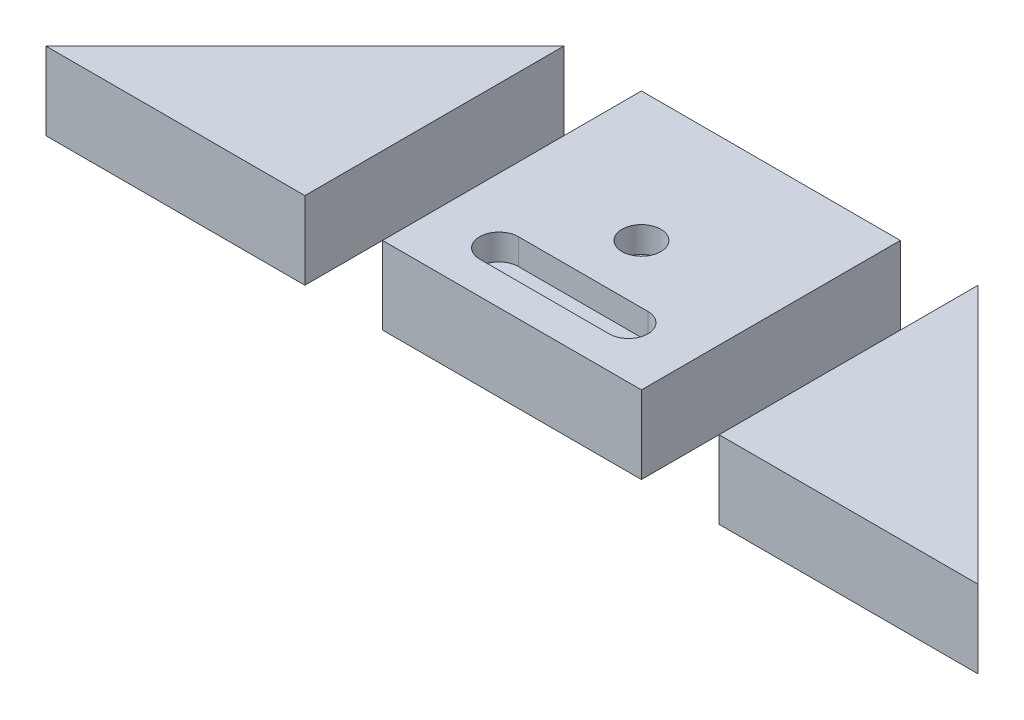
ISO-10303-21;
HEADER;
FILE_DESCRIPTION(('STEP AP214'),'2;1');
FILE_NAME('part.step','',(''),(''),'','','');
FILE_SCHEMA(('AUTOMOTIVE_DESIGN { 1 0 10303 214 1 1 1 1 }'));
ENDSEC;
DATA;
#1=APPLICATION_CONTEXT('core data for automotive mechanical design processes');
#2=APPLICATION_PROTOCOL_DEFINITION('international standard','automotive_design',2000,#1);
#3=PRODUCT_CONTEXT('',#1,'mechanical');
#4=PRODUCT('Part','Part','',(#3));
#5=PRODUCT_RELATED_PRODUCT_CATEGORY('part','',(#4));
#6=PRODUCT_DEFINITION_FORMATION('','',#4);
#7=PRODUCT_DEFINITION_CONTEXT('part definition',#1,'design');
#8=PRODUCT_DEFINITION('design','',#6,#7);
#9=PRODUCT_DEFINITION_SHAPE('','',#8);
#10=(LENGTH_UNIT() NAMED_UNIT(*) SI_UNIT(.MILLI.,.METRE.));
#11=(NAMED_UNIT(*) PLANE_ANGLE_UNIT() SI_UNIT($,.RADIAN.));
#12=(NAMED_UNIT(*) SI_UNIT($,.STERADIAN.) SOLID_ANGLE_UNIT());
#13=UNCERTAINTY_MEASURE_WITH_UNIT(LENGTH_MEASURE(1.E-05),#10,'distance_accuracy_value','');
#14=(GEOMETRIC_REPRESENTATION_CONTEXT(3) GLOBAL_UNCERTAINTY_ASSIGNED_CONTEXT((#13)) GLOBAL_UNIT_ASSIGNED_CONTEXT((#10,
#11,#12)) REPRESENTATION_CONTEXT('',''));
#15=CARTESIAN_POINT('',(0.,0.,0.));
#16=DIRECTION('',(0.,0.,1.));
#17=DIRECTION('',(1.,0.,0.));
#18=AXIS2_PLACEMENT_3D('',#15,#16,#17);
#19=CARTESIAN_POINT('',(-80.,30.,-50.));
#20=DIRECTION('',(-1.,0.,0.));
#21=DIRECTION('',(0.,0.,-1.));
#22=AXIS2_PLACEMENT_3D('',#19,#20,#21);
#23=PLANE('',#22);
#24=DIRECTION('',(0.,0.,1.));
#25=VECTOR('',#24,1.);
#26=CARTESIAN_POINT('',(-80.,0.,-50.));
#27=LINE('',#26,#25);
#28=CARTESIAN_POINT('',(-80.,0.,-50.));
#29=VERTEX_POINT('',#28);
#30=CARTESIAN_POINT('',(-80.,0.,50.));
#31=VERTEX_POINT('',#30);
#32=EDGE_CURVE('E12',#29,#31,#27,.T.);
#33=ORIENTED_EDGE('',*,*,#32,.F.);
#34=DIRECTION('',(0.,-1.,0.));
#35=VECTOR('',#34,1.);
#36=CARTESIAN_POINT('',(-80.,30.,-50.));
#37=LINE('',#36,#35);
#38=CARTESIAN_POINT('',(-80.,30.,-50.));
#39=VERTEX_POINT('',#38);
#40=EDGE_CURVE('E97',#39,#29,#37,.T.);
#41=ORIENTED_EDGE('',*,*,#40,.F.);
#42=DIRECTION('',(0.,0.,1.));
#43=VECTOR('',#42,1.);
#44=CARTESIAN_POINT('',(-80.,30.,-50.));
#45=LINE('',#44,#43);
#46=CARTESIAN_POINT('',(-80.,30.,50.));
#47=VERTEX_POINT('',#46);
#48=EDGE_CURVE('E56',#39,#47,#45,.T.);
#49=ORIENTED_EDGE('',*,*,#48,.T.);
#50=DIRECTION('',(0.,-1.,0.));
#51=VECTOR('',#50,1.);
#52=CARTESIAN_POINT('',(-80.,30.,50.));
#53=LINE('',#52,#51);
#54=EDGE_CURVE('E103',#47,#31,#53,.T.);
#55=ORIENTED_EDGE('',*,*,#54,.T.);
#56=EDGE_LOOP('',(#33,#41,#49,#55));
#57=FACE_BOUND('',#56,.T.);
#58=ADVANCED_FACE('F52',(#57),#23,.F.);
#59=CARTESIAN_POINT('',(-80.,30.,50.));
#60=DIRECTION('',(0.,0.,-1.));
#61=DIRECTION('',(1.,0.,0.));
#62=AXIS2_PLACEMENT_3D('',#59,#60,#61);
#63=PLANE('',#62);
#64=DIRECTION('',(-1.,0.,0.));
#65=VECTOR('',#64,1.);
#66=CARTESIAN_POINT('',(-80.,0.,50.));
#67=LINE('',#66,#65);
#68=CARTESIAN_POINT('',(-180.,0.,50.));
#69=VERTEX_POINT('',#68);
#70=EDGE_CURVE('E62',#31,#69,#67,.T.);
#71=ORIENTED_EDGE('',*,*,#70,.F.);
#72=ORIENTED_EDGE('',*,*,#54,.F.);
#73=DIRECTION('',(-1.,0.,0.));
#74=VECTOR('',#73,1.);
#75=CARTESIAN_POINT('',(-80.,30.,50.));
#76=LINE('',#75,#74);
#77=CARTESIAN_POINT('',(-180.,30.,50.));
#78=VERTEX_POINT('',#77);
#79=EDGE_CURVE('E87',#47,#78,#76,.T.);
#80=ORIENTED_EDGE('',*,*,#79,.T.);
#81=DIRECTION('',(0.,-1.,0.));
#82=VECTOR('',#81,1.);
#83=CARTESIAN_POINT('',(-180.,30.,50.));
#84=LINE('',#83,#82);
#85=EDGE_CURVE('E101',#78,#69,#84,.T.);
#86=ORIENTED_EDGE('',*,*,#85,.T.);
#87=EDGE_LOOP('',(#71,#72,#80,#86));
#88=FACE_BOUND('',#87,.T.);
#89=ADVANCED_FACE('F108',(#88),#63,.F.);
#90=CARTESIAN_POINT('',(-180.,30.,50.));
#91=DIRECTION('',(0.707106781186547,0.,0.707106781186547));
#92=DIRECTION('',(-0.707106781186548,0.,0.707106781186548));
#93=AXIS2_PLACEMENT_3D('',#90,#91,#92);
#94=PLANE('',#93);
#95=DIRECTION('',(0.707106781186547,0.,-0.707106781186547));
#96=VECTOR('',#95,1.);
#97=CARTESIAN_POINT('',(-180.,0.,50.));
#98=LINE('',#97,#96);
#99=EDGE_CURVE('E90',#69,#29,#98,.T.);
#100=ORIENTED_EDGE('',*,*,#99,.F.);
#101=ORIENTED_EDGE('',*,*,#85,.F.);
#102=DIRECTION('',(0.707106781186547,0.,-0.707106781186547));
#103=VECTOR('',#102,1.);
#104=CARTESIAN_POINT('',(-180.,30.,50.));
#105=LINE('',#104,#103);
#106=EDGE_CURVE('E84',#78,#39,#105,.T.);
#107=ORIENTED_EDGE('',*,*,#106,.T.);
#108=ORIENTED_EDGE('',*,*,#40,.T.);
#109=EDGE_LOOP('',(#100,#101,#107,#108));
#110=FACE_BOUND('',#109,.T.);
#111=ADVANCED_FACE('F98',(#110),#94,.F.);
#112=CARTESIAN_POINT('',(0.,30.,0.));
#113=DIRECTION('',(0.,1.,0.));
#114=DIRECTION('',(0.,0.,1.));
#115=AXIS2_PLACEMENT_3D('',#112,#113,#114);
#116=PLANE('',#115);
#117=ORIENTED_EDGE('',*,*,#48,.F.);
#118=ORIENTED_EDGE('',*,*,#106,.F.);
#119=ORIENTED_EDGE('',*,*,#79,.F.);
#120=EDGE_LOOP('',(#117,#118,#119));
#121=FACE_BOUND('',#120,.T.);
#122=ADVANCED_FACE('F54',(#121),#116,.T.);
#123=CARTESIAN_POINT('',(0.,0.,0.));
#124=DIRECTION('',(0.,1.,0.));
#125=DIRECTION('',(0.,0.,1.));
#126=AXIS2_PLACEMENT_3D('',#123,#124,#125);
#127=PLANE('',#126);
#128=ORIENTED_EDGE('',*,*,#32,.T.);
#129=ORIENTED_EDGE('',*,*,#70,.T.);
#130=ORIENTED_EDGE('',*,*,#99,.T.);
#131=EDGE_LOOP('',(#128,#129,#130));
#132=FACE_BOUND('',#131,.T.);
#133=ADVANCED_FACE('F92',(#132),#127,.F.);
#134=CLOSED_SHELL('',(#58,#89,#111,#122,#133));
#135=MANIFOLD_SOLID_BREP('B2',#134);
#136=CARTESIAN_POINT('',(80.,30.,-50.));
#137=DIRECTION('',(1.,0.,0.));
#138=DIRECTION('',(0.,0.,-1.));
#139=AXIS2_PLACEMENT_3D('',#136,#137,#138);
#140=PLANE('',#139);
#141=DIRECTION('',(0.,0.,1.));
#142=VECTOR('',#141,1.);
#143=CARTESIAN_POINT('',(80.,0.,-50.));
#144=LINE('',#143,#142);
#145=CARTESIAN_POINT('',(80.,0.,-50.));
#146=VERTEX_POINT('',#145);
#147=CARTESIAN_POINT('',(80.,0.,50.));
#148=VERTEX_POINT('',#147);
#149=EDGE_CURVE('E50',#146,#148,#144,.T.);
#150=ORIENTED_EDGE('',*,*,#149,.T.);
#151=DIRECTION('',(0.,-1.,0.));
#152=VECTOR('',#151,1.);
#153=CARTESIAN_POINT('',(80.,30.,50.));
#154=LINE('',#153,#152);
#155=CARTESIAN_POINT('',(80.,30.,50.));
#156=VERTEX_POINT('',#155);
#157=EDGE_CURVE('E249',#156,#148,#154,.T.);
#158=ORIENTED_EDGE('',*,*,#157,.F.);
#159=DIRECTION('',(0.,0.,1.));
#160=VECTOR('',#159,1.);
#161=CARTESIAN_POINT('',(80.,30.,-50.));
#162=LINE('',#161,#160);
#163=CARTESIAN_POINT('',(80.,30.,-50.));
#164=VERTEX_POINT('',#163);
#165=EDGE_CURVE('E163',#164,#156,#162,.T.);
#166=ORIENTED_EDGE('',*,*,#165,.F.);
#167=DIRECTION('',(0.,-1.,0.));
#168=VECTOR('',#167,1.);
#169=CARTESIAN_POINT('',(80.,30.,-50.));
#170=LINE('',#169,#168);
#171=EDGE_CURVE('E201',#164,#146,#170,.T.);
#172=ORIENTED_EDGE('',*,*,#171,.T.);
#173=EDGE_LOOP('',(#150,#158,#166,#172));
#174=FACE_BOUND('',#173,.T.);
#175=ADVANCED_FACE('F159',(#174),#140,.F.);
#176=CARTESIAN_POINT('',(80.,30.,50.));
#177=DIRECTION('',(0.,0.,-1.));
#178=DIRECTION('',(-1.,0.,0.));
#179=AXIS2_PLACEMENT_3D('',#176,#177,#178);
#180=PLANE('',#179);
#181=DIRECTION('',(1.,0.,0.));
#182=VECTOR('',#181,1.);
#183=CARTESIAN_POINT('',(80.,0.,50.));
#184=LINE('',#183,#182);
#185=CARTESIAN_POINT('',(180.,0.,50.));
#186=VERTEX_POINT('',#185);
#187=EDGE_CURVE('E169',#148,#186,#184,.T.);
#188=ORIENTED_EDGE('',*,*,#187,.T.);
#189=DIRECTION('',(0.,-1.,0.));
#190=VECTOR('',#189,1.);
#191=CARTESIAN_POINT('',(180.,30.,50.));
#192=LINE('',#191,#190);
#193=CARTESIAN_POINT('',(180.,30.,50.));
#194=VERTEX_POINT('',#193);
#195=EDGE_CURVE('E203',#194,#186,#192,.T.);
#196=ORIENTED_EDGE('',*,*,#195,.F.);
#197=DIRECTION('',(1.,0.,0.));
#198=VECTOR('',#197,1.);
#199=CARTESIAN_POINT('',(80.,30.,50.));
#200=LINE('',#199,#198);
#201=EDGE_CURVE('E190',#156,#194,#200,.T.);
#202=ORIENTED_EDGE('',*,*,#201,.F.);
#203=ORIENTED_EDGE('',*,*,#157,.T.);
#204=EDGE_LOOP('',(#188,#196,#202,#203));
#205=FACE_BOUND('',#204,.T.);
#206=ADVANCED_FACE('F216',(#205),#180,.F.);
#207=CARTESIAN_POINT('',(180.,30.,50.));
#208=DIRECTION('',(-0.707106781186547,0.,0.707106781186547));
#209=DIRECTION('',(0.707106781186548,0.,0.707106781186548));
#210=AXIS2_PLACEMENT_3D('',#207,#208,#209);
#211=PLANE('',#210);
#212=DIRECTION('',(-0.707106781186547,0.,-0.707106781186547));
#213=VECTOR('',#212,1.);
#214=CARTESIAN_POINT('',(180.,0.,50.));
#215=LINE('',#214,#213);
#216=EDGE_CURVE('E197',#186,#146,#215,.T.);
#217=ORIENTED_EDGE('',*,*,#216,.T.);
#218=ORIENTED_EDGE('',*,*,#171,.F.);
#219=DIRECTION('',(-0.707106781186547,0.,-0.707106781186547));
#220=VECTOR('',#219,1.);
#221=CARTESIAN_POINT('',(180.,30.,50.));
#222=LINE('',#221,#220);
#223=EDGE_CURVE('E207',#194,#164,#222,.T.);
#224=ORIENTED_EDGE('',*,*,#223,.F.);
#225=ORIENTED_EDGE('',*,*,#195,.T.);
#226=EDGE_LOOP('',(#217,#218,#224,#225));
#227=FACE_BOUND('',#226,.T.);
#228=ADVANCED_FACE('F199',(#227),#211,.F.);
#229=CARTESIAN_POINT('',(0.,30.,0.));
#230=DIRECTION('',(0.,1.,0.));
#231=DIRECTION('',(0.,0.,1.));
#232=AXIS2_PLACEMENT_3D('',#229,#230,#231);
#233=PLANE('',#232);
#234=ORIENTED_EDGE('',*,*,#165,.T.);
#235=ORIENTED_EDGE('',*,*,#201,.T.);
#236=ORIENTED_EDGE('',*,*,#223,.T.);
#237=EDGE_LOOP('',(#234,#235,#236));
#238=FACE_BOUND('',#237,.T.);
#239=ADVANCED_FACE('F161',(#238),#233,.T.);
#240=CARTESIAN_POINT('',(0.,0.,0.));
#241=DIRECTION('',(0.,1.,0.));
#242=DIRECTION('',(0.,0.,1.));
#243=AXIS2_PLACEMENT_3D('',#240,#241,#242);
#244=PLANE('',#243);
#245=ORIENTED_EDGE('',*,*,#149,.F.);
#246=ORIENTED_EDGE('',*,*,#216,.F.);
#247=ORIENTED_EDGE('',*,*,#187,.F.);
#248=EDGE_LOOP('',(#245,#246,#247));
#249=FACE_BOUND('',#248,.T.);
#250=ADVANCED_FACE('F209',(#249),#244,.F.);
#251=CLOSED_SHELL('',(#175,#206,#228,#239,#250));
#252=MANIFOLD_SOLID_BREP('B6',#251);
#253=CARTESIAN_POINT('',(50.,30.,50.));
#254=DIRECTION('',(-1.,0.,0.));
#255=DIRECTION('',(0.,0.,1.));
#256=AXIS2_PLACEMENT_3D('',#253,#254,#255);
#257=PLANE('',#256);
#258=DIRECTION('',(0.,0.,-1.));
#259=VECTOR('',#258,1.);
#260=CARTESIAN_POINT('',(50.,0.,50.));
#261=LINE('',#260,#259);
#262=CARTESIAN_POINT('',(50.,0.,50.));
#263=VERTEX_POINT('',#262);
#264=CARTESIAN_POINT('',(50.,0.,-50.));
#265=VERTEX_POINT('',#264);
#266=EDGE_CURVE('E375',#263,#265,#261,.T.);
#267=ORIENTED_EDGE('',*,*,#266,.T.);
#268=DIRECTION('',(0.,-1.,0.));
#269=VECTOR('',#268,1.);
#270=CARTESIAN_POINT('',(50.,30.,-50.));
#271=LINE('',#270,#269);
#272=CARTESIAN_POINT('',(50.,30.,-50.));
#273=VERTEX_POINT('',#272);
#274=EDGE_CURVE('E157',#273,#265,#271,.T.);
#275=ORIENTED_EDGE('',*,*,#274,.F.);
#276=DIRECTION('',(0.,0.,-1.));
#277=VECTOR('',#276,1.);
#278=CARTESIAN_POINT('',(50.,30.,50.));
#279=LINE('',#278,#277);
#280=CARTESIAN_POINT('',(50.,30.,50.));
#281=VERTEX_POINT('',#280);
#282=EDGE_CURVE('E368',#281,#273,#279,.T.);
#283=ORIENTED_EDGE('',*,*,#282,.F.);
#284=DIRECTION('',(0.,-1.,0.));
#285=VECTOR('',#284,1.);
#286=CARTESIAN_POINT('',(50.,30.,50.));
#287=LINE('',#286,#285);
#288=EDGE_CURVE('E374',#281,#263,#287,.T.);
#289=ORIENTED_EDGE('',*,*,#288,.T.);
#290=EDGE_LOOP('',(#267,#275,#283,#289));
#291=FACE_BOUND('',#290,.T.);
#292=ADVANCED_FACE('F257',(#291),#257,.F.);
#293=CARTESIAN_POINT('',(-50.,30.,-50.));
#294=DIRECTION('',(0.,0.,1.));
#295=DIRECTION('',(1.,0.,0.));
#296=AXIS2_PLACEMENT_3D('',#293,#294,#295);
#297=PLANE('',#296);
#298=DIRECTION('',(-1.,0.,0.));
#299=VECTOR('',#298,1.);
#300=CARTESIAN_POINT('',(-50.,0.,-50.));
#301=LINE('',#300,#299);
#302=CARTESIAN_POINT('',(-50.,0.,-50.));
#303=VERTEX_POINT('',#302);
#304=EDGE_CURVE('E378',#265,#303,#301,.T.);
#305=ORIENTED_EDGE('',*,*,#304,.T.);
#306=DIRECTION('',(0.,-1.,0.));
#307=VECTOR('',#306,1.);
#308=CARTESIAN_POINT('',(-50.,30.,-50.));
#309=LINE('',#308,#307);
#310=CARTESIAN_POINT('',(-50.,30.,-50.));
#311=VERTEX_POINT('',#310);
#312=EDGE_CURVE('E264',#311,#303,#309,.T.);
#313=ORIENTED_EDGE('',*,*,#312,.F.);
#314=DIRECTION('',(-1.,0.,0.));
#315=VECTOR('',#314,1.);
#316=CARTESIAN_POINT('',(-50.,30.,-50.));
#317=LINE('',#316,#315);
#318=EDGE_CURVE('E308',#273,#311,#317,.T.);
#319=ORIENTED_EDGE('',*,*,#318,.F.);
#320=ORIENTED_EDGE('',*,*,#274,.T.);
#321=EDGE_LOOP('',(#305,#313,#319,#320));
#322=FACE_BOUND('',#321,.T.);
#323=ADVANCED_FACE('F407',(#322),#297,.F.);
#324=CARTESIAN_POINT('',(-50.,30.,50.));
#325=DIRECTION('',(1.,0.,0.));
#326=DIRECTION('',(0.,0.,-1.));
#327=AXIS2_PLACEMENT_3D('',#324,#325,#326);
#328=PLANE('',#327);
#329=DIRECTION('',(0.,0.,1.));
#330=VECTOR('',#329,1.);
#331=CARTESIAN_POINT('',(-50.,0.,50.));
#332=LINE('',#331,#330);
#333=CARTESIAN_POINT('',(-50.,0.,50.));
#334=VERTEX_POINT('',#333);
#335=EDGE_CURVE('E380',#303,#334,#332,.T.);
#336=ORIENTED_EDGE('',*,*,#335,.T.);
#337=DIRECTION('',(0.,-1.,0.));
#338=VECTOR('',#337,1.);
#339=CARTESIAN_POINT('',(-50.,30.,50.));
#340=LINE('',#339,#338);
#341=CARTESIAN_POINT('',(-50.,30.,50.));
#342=VERTEX_POINT('',#341);
#343=EDGE_CURVE('E384',#342,#334,#340,.T.);
#344=ORIENTED_EDGE('',*,*,#343,.F.);
#345=DIRECTION('',(0.,0.,1.));
#346=VECTOR('',#345,1.);
#347=CARTESIAN_POINT('',(-50.,30.,50.));
#348=LINE('',#347,#346);
#349=EDGE_CURVE('E371',#311,#342,#348,.T.);
#350=ORIENTED_EDGE('',*,*,#349,.F.);
#351=ORIENTED_EDGE('',*,*,#312,.T.);
#352=EDGE_LOOP('',(#336,#344,#350,#351));
#353=FACE_BOUND('',#352,.T.);
#354=ADVANCED_FACE('F389',(#353),#328,.F.);
#355=CARTESIAN_POINT('',(-50.,30.,50.));
#356=DIRECTION('',(0.,0.,-1.));
#357=DIRECTION('',(-1.,0.,0.));
#358=AXIS2_PLACEMENT_3D('',#355,#356,#357);
#359=PLANE('',#358);
#360=DIRECTION('',(1.,0.,0.));
#361=VECTOR('',#360,1.);
#362=CARTESIAN_POINT('',(-50.,0.,50.));
#363=LINE('',#362,#361);
#364=EDGE_CURVE('E301',#334,#263,#363,.T.);
#365=ORIENTED_EDGE('',*,*,#364,.T.);
#366=ORIENTED_EDGE('',*,*,#288,.F.);
#367=DIRECTION('',(1.,0.,0.));
#368=VECTOR('',#367,1.);
#369=CARTESIAN_POINT('',(-50.,30.,50.));
#370=LINE('',#369,#368);
#371=EDGE_CURVE('E280',#342,#281,#370,.T.);
#372=ORIENTED_EDGE('',*,*,#371,.F.);
#373=ORIENTED_EDGE('',*,*,#343,.T.);
#374=EDGE_LOOP('',(#365,#366,#372,#373));
#375=FACE_BOUND('',#374,.T.);
#376=ADVANCED_FACE('F397',(#375),#359,.F.);
#377=CARTESIAN_POINT('',(0.,30.,0.));
#378=DIRECTION('',(0.,-1.,0.));
#379=DIRECTION('',(0.,0.,-1.));
#380=AXIS2_PLACEMENT_3D('',#377,#378,#379);
#381=PLANE('',#380);
#382=CARTESIAN_POINT('',(0.,30.,0.));
#383=DIRECTION('',(0.,1.,0.));
#384=DIRECTION('',(0.,0.,1.));
#385=AXIS2_PLACEMENT_3D('',#382,#383,#384);
#386=CIRCLE('',#385,7.5);
#387=CARTESIAN_POINT('',(0.,30.,7.5));
#388=VERTEX_POINT('',#387);
#389=EDGE_CURVE('E350',#388,#388,#386,.T.);
#390=ORIENTED_EDGE('',*,*,#389,.F.);
#391=EDGE_LOOP('',(#390));
#392=FACE_BOUND('',#391,.T.);
#393=DIRECTION('',(1.,0.,0.));
#394=VECTOR('',#393,1.);
#395=CARTESIAN_POINT('',(-25.,30.,37.5));
#396=LINE('',#395,#394);
#397=CARTESIAN_POINT('',(-25.,30.,37.5));
#398=VERTEX_POINT('',#397);
#399=CARTESIAN_POINT('',(25.,30.,37.5));
#400=VERTEX_POINT('',#399);
#401=EDGE_CURVE('E349',#398,#400,#396,.T.);
#402=ORIENTED_EDGE('',*,*,#401,.F.);
#403=CARTESIAN_POINT('',(-25.,30.,30.));
#404=DIRECTION('',(0.,1.,0.));
#405=DIRECTION('',(0.,0.,1.));
#406=AXIS2_PLACEMENT_3D('',#403,#404,#405);
#407=CIRCLE('',#406,7.5);
#408=CARTESIAN_POINT('',(-25.,30.,22.5));
#409=VERTEX_POINT('',#408);
#410=EDGE_CURVE('E271',#409,#398,#407,.T.);
#411=ORIENTED_EDGE('',*,*,#410,.F.);
#412=DIRECTION('',(1.,0.,0.));
#413=VECTOR('',#412,1.);
#414=CARTESIAN_POINT('',(-25.,30.,22.5));
#415=LINE('',#414,#413);
#416=CARTESIAN_POINT('',(25.,30.,22.5));
#417=VERTEX_POINT('',#416);
#418=EDGE_CURVE('E338',#409,#417,#415,.T.);
#419=ORIENTED_EDGE('',*,*,#418,.T.);
#420=CARTESIAN_POINT('',(25.,30.,30.));
#421=DIRECTION('',(0.,1.,0.));
#422=DIRECTION('',(0.,0.,1.));
#423=AXIS2_PLACEMENT_3D('',#420,#421,#422);
#424=CIRCLE('',#423,7.5);
#425=EDGE_CURVE('E344',#400,#417,#424,.T.);
#426=ORIENTED_EDGE('',*,*,#425,.F.);
#427=EDGE_LOOP('',(#402,#411,#419,#426));
#428=FACE_BOUND('',#427,.T.);
#429=ORIENTED_EDGE('',*,*,#282,.T.);
#430=ORIENTED_EDGE('',*,*,#318,.T.);
#431=ORIENTED_EDGE('',*,*,#349,.T.);
#432=ORIENTED_EDGE('',*,*,#371,.T.);
#433=EDGE_LOOP('',(#429,#430,#431,#432));
#434=FACE_BOUND('',#433,.T.);
#435=ADVANCED_FACE('F347',(#392,#428,#434),#381,.F.);
#436=CARTESIAN_POINT('',(0.,0.,0.));
#437=DIRECTION('',(0.,-1.,0.));
#438=DIRECTION('',(0.,0.,-1.));
#439=AXIS2_PLACEMENT_3D('',#436,#437,#438);
#440=PLANE('',#439);
#441=ORIENTED_EDGE('',*,*,#266,.F.);
#442=ORIENTED_EDGE('',*,*,#364,.F.);
#443=ORIENTED_EDGE('',*,*,#335,.F.);
#444=ORIENTED_EDGE('',*,*,#304,.F.);
#445=EDGE_LOOP('',(#441,#442,#443,#444));
#446=FACE_BOUND('',#445,.T.);
#447=ADVANCED_FACE('F393',(#446),#440,.T.);
#448=CARTESIAN_POINT('',(-25.,20.,30.));
#449=DIRECTION('',(0.,1.,0.));
#450=DIRECTION('',(0.,0.,1.));
#451=AXIS2_PLACEMENT_3D('',#448,#449,#450);
#452=CYLINDRICAL_SURFACE('',#451,7.5);
#453=ORIENTED_EDGE('',*,*,#410,.T.);
#454=DIRECTION('',(0.,1.,0.));
#455=VECTOR('',#454,1.);
#456=CARTESIAN_POINT('',(-25.,20.,37.5));
#457=LINE('',#456,#455);
#458=CARTESIAN_POINT('',(-25.,20.,37.5));
#459=VERTEX_POINT('',#458);
#460=EDGE_CURVE('E361',#459,#398,#457,.T.);
#461=ORIENTED_EDGE('',*,*,#460,.F.);
#462=CARTESIAN_POINT('',(-25.,20.,30.));
#463=DIRECTION('',(0.,1.,0.));
#464=DIRECTION('',(0.,0.,1.));
#465=AXIS2_PLACEMENT_3D('',#462,#463,#464);
#466=CIRCLE('',#465,7.5);
#467=CARTESIAN_POINT('',(-25.,20.,22.5));
#468=VERTEX_POINT('',#467);
#469=EDGE_CURVE('E332',#468,#459,#466,.T.);
#470=ORIENTED_EDGE('',*,*,#469,.F.);
#471=DIRECTION('',(0.,1.,0.));
#472=VECTOR('',#471,1.);
#473=CARTESIAN_POINT('',(-25.,20.,22.5));
#474=LINE('',#473,#472);
#475=EDGE_CURVE('E328',#468,#409,#474,.T.);
#476=ORIENTED_EDGE('',*,*,#475,.T.);
#477=EDGE_LOOP('',(#453,#461,#470,#476));
#478=FACE_BOUND('',#477,.T.);
#479=ADVANCED_FACE('F330',(#478),#452,.F.);
#480=CARTESIAN_POINT('',(-25.,20.,22.5));
#481=DIRECTION('',(0.,0.,1.));
#482=DIRECTION('',(1.,0.,0.));
#483=AXIS2_PLACEMENT_3D('',#480,#481,#482);
#484=PLANE('',#483);
#485=ORIENTED_EDGE('',*,*,#418,.F.);
#486=ORIENTED_EDGE('',*,*,#475,.F.);
#487=DIRECTION('',(1.,0.,0.));
#488=VECTOR('',#487,1.);
#489=CARTESIAN_POINT('',(-25.,20.,22.5));
#490=LINE('',#489,#488);
#491=CARTESIAN_POINT('',(25.,20.,22.5));
#492=VERTEX_POINT('',#491);
#493=EDGE_CURVE('E358',#468,#492,#490,.T.);
#494=ORIENTED_EDGE('',*,*,#493,.T.);
#495=DIRECTION('',(0.,1.,0.));
#496=VECTOR('',#495,1.);
#497=CARTESIAN_POINT('',(25.,20.,22.5));
#498=LINE('',#497,#496);
#499=EDGE_CURVE('E335',#492,#417,#498,.T.);
#500=ORIENTED_EDGE('',*,*,#499,.T.);
#501=EDGE_LOOP('',(#485,#486,#494,#500));
#502=FACE_BOUND('',#501,.T.);
#503=ADVANCED_FACE('F339',(#502),#484,.T.);
#504=CARTESIAN_POINT('',(25.,20.,30.));
#505=DIRECTION('',(0.,1.,0.));
#506=DIRECTION('',(0.,0.,1.));
#507=AXIS2_PLACEMENT_3D('',#504,#505,#506);
#508=CYLINDRICAL_SURFACE('',#507,7.5);
#509=ORIENTED_EDGE('',*,*,#425,.T.);
#510=ORIENTED_EDGE('',*,*,#499,.F.);
#511=CARTESIAN_POINT('',(25.,20.,30.));
#512=DIRECTION('',(0.,1.,0.));
#513=DIRECTION('',(0.,0.,1.));
#514=AXIS2_PLACEMENT_3D('',#511,#512,#513);
#515=CIRCLE('',#514,7.5);
#516=CARTESIAN_POINT('',(25.,20.,37.5));
#517=VERTEX_POINT('',#516);
#518=EDGE_CURVE('E360',#517,#492,#515,.T.);
#519=ORIENTED_EDGE('',*,*,#518,.F.);
#520=DIRECTION('',(0.,1.,0.));
#521=VECTOR('',#520,1.);
#522=CARTESIAN_POINT('',(25.,20.,37.5));
#523=LINE('',#522,#521);
#524=EDGE_CURVE('E512',#517,#400,#523,.T.);
#525=ORIENTED_EDGE('',*,*,#524,.T.);
#526=EDGE_LOOP('',(#509,#510,#519,#525));
#527=FACE_BOUND('',#526,.T.);
#528=ADVANCED_FACE('F455',(#527),#508,.F.);
#529=CARTESIAN_POINT('',(-25.,20.,37.5));
#530=DIRECTION('',(0.,0.,1.));
#531=DIRECTION('',(1.,0.,0.));
#532=AXIS2_PLACEMENT_3D('',#529,#530,#531);
#533=PLANE('',#532);
#534=ORIENTED_EDGE('',*,*,#401,.T.);
#535=ORIENTED_EDGE('',*,*,#524,.F.);
#536=DIRECTION('',(1.,0.,0.));
#537=VECTOR('',#536,1.);
#538=CARTESIAN_POINT('',(-25.,20.,37.5));
#539=LINE('',#538,#537);
#540=EDGE_CURVE('E364',#459,#517,#539,.T.);
#541=ORIENTED_EDGE('',*,*,#540,.F.);
#542=ORIENTED_EDGE('',*,*,#460,.T.);
#543=EDGE_LOOP('',(#534,#535,#541,#542));
#544=FACE_BOUND('',#543,.T.);
#545=ADVANCED_FACE('F464',(#544),#533,.F.);
#546=CARTESIAN_POINT('',(-25.,20.,30.));
#547=DIRECTION('',(0.,1.,0.));
#548=DIRECTION('',(0.,0.,1.));
#549=AXIS2_PLACEMENT_3D('',#546,#547,#548);
#550=PLANE('',#549);
#551=ORIENTED_EDGE('',*,*,#469,.T.);
#552=ORIENTED_EDGE('',*,*,#540,.T.);
#553=ORIENTED_EDGE('',*,*,#518,.T.);
#554=ORIENTED_EDGE('',*,*,#493,.F.);
#555=EDGE_LOOP('',(#551,#552,#553,#554));
#556=FACE_BOUND('',#555,.T.);
#557=ADVANCED_FACE('F474',(#556),#550,.T.);
#558=CARTESIAN_POINT('',(0.,20.,0.));
#559=DIRECTION('',(0.,1.,0.));
#560=DIRECTION('',(0.,0.,1.));
#561=AXIS2_PLACEMENT_3D('',#558,#559,#560);
#562=CYLINDRICAL_SURFACE('',#561,7.5);
#563=CARTESIAN_POINT('',(0.,20.,0.));
#564=DIRECTION('',(0.,1.,0.));
#565=DIRECTION('',(0.,0.,1.));
#566=AXIS2_PLACEMENT_3D('',#563,#564,#565);
#567=CIRCLE('',#566,7.5);
#568=CARTESIAN_POINT('',(0.,20.,7.5));
#569=VERTEX_POINT('',#568);
#570=EDGE_CURVE('E353',#569,#569,#567,.T.);
#571=ORIENTED_EDGE('',*,*,#570,.F.);
#572=EDGE_LOOP('',(#571));
#573=FACE_BOUND('',#572,.T.);
#574=ORIENTED_EDGE('',*,*,#389,.T.);
#575=EDGE_LOOP('',(#574));
#576=FACE_BOUND('',#575,.T.);
#577=ADVANCED_FACE('F484',(#573,#576),#562,.F.);
#578=CARTESIAN_POINT('',(0.,20.,0.));
#579=DIRECTION('',(0.,1.,0.));
#580=DIRECTION('',(0.,0.,1.));
#581=AXIS2_PLACEMENT_3D('',#578,#579,#580);
#582=PLANE('',#581);
#583=ORIENTED_EDGE('',*,*,#570,.T.);
#584=EDGE_LOOP('',(#583));
#585=FACE_BOUND('',#584,.T.);
#586=ADVANCED_FACE('F494',(#585),#582,.T.);
#587=CLOSED_SHELL('',(#292,#323,#354,#376,#435,#447,#479,#503,#528,#545,#557,#577,#586));
#588=MANIFOLD_SOLID_BREP('B44',#587);
#589=ADVANCED_BREP_SHAPE_REPRESENTATION('',(#18,#135,#252,#588),#14);
#590=SHAPE_DEFINITION_REPRESENTATION(#9,#589);
ENDSEC;
END-ISO-10303-21;
